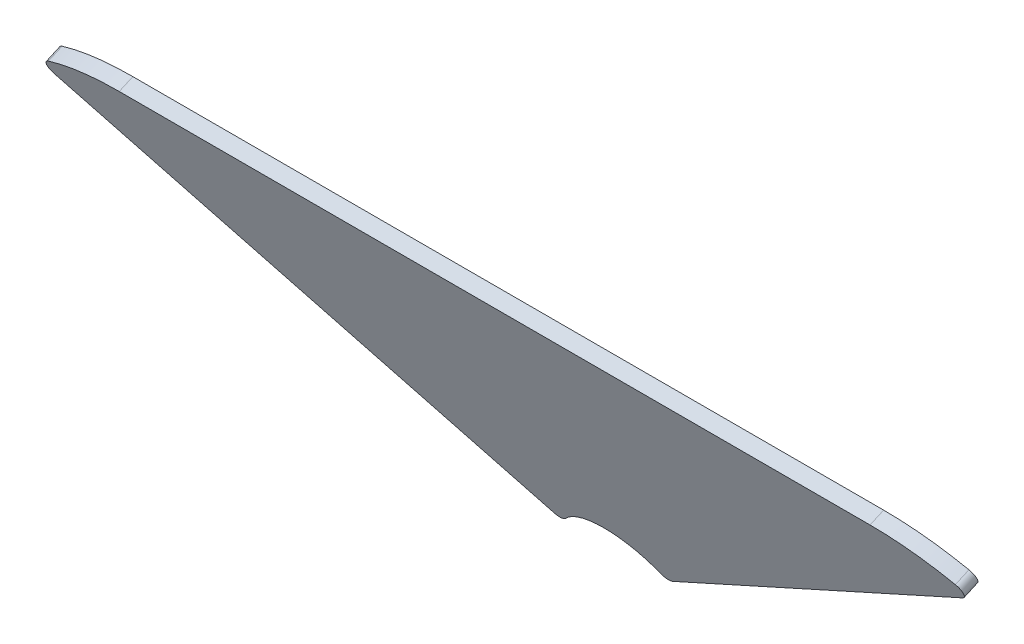
ISO-10303-21;
HEADER;
FILE_DESCRIPTION(('STEP AP214'),'2;1');
FILE_NAME('part.step','',(''),(''),'','','');
FILE_SCHEMA(('AUTOMOTIVE_DESIGN { 1 0 10303 214 1 1 1 1 }'));
ENDSEC;
DATA;
#1=APPLICATION_CONTEXT('core data for automotive mechanical design processes');
#2=APPLICATION_PROTOCOL_DEFINITION('international standard','automotive_design',2000,#1);
#3=PRODUCT_CONTEXT('',#1,'mechanical');
#4=PRODUCT('Part','Part','',(#3));
#5=PRODUCT_RELATED_PRODUCT_CATEGORY('part','',(#4));
#6=PRODUCT_DEFINITION_FORMATION('','',#4);
#7=PRODUCT_DEFINITION_CONTEXT('part definition',#1,'design');
#8=PRODUCT_DEFINITION('design','',#6,#7);
#9=PRODUCT_DEFINITION_SHAPE('','',#8);
#10=(LENGTH_UNIT() NAMED_UNIT(*) SI_UNIT(.MILLI.,.METRE.));
#11=(NAMED_UNIT(*) PLANE_ANGLE_UNIT() SI_UNIT($,.RADIAN.));
#12=(NAMED_UNIT(*) SI_UNIT($,.STERADIAN.) SOLID_ANGLE_UNIT());
#13=UNCERTAINTY_MEASURE_WITH_UNIT(LENGTH_MEASURE(1.E-05),#10,'distance_accuracy_value','');
#14=(GEOMETRIC_REPRESENTATION_CONTEXT(3) GLOBAL_UNCERTAINTY_ASSIGNED_CONTEXT((#13)) GLOBAL_UNIT_ASSIGNED_CONTEXT((#10,
#11,#12)) REPRESENTATION_CONTEXT('',''));
#15=CARTESIAN_POINT('',(0.,0.,0.));
#16=DIRECTION('',(0.,0.,1.));
#17=DIRECTION('',(1.,0.,0.));
#18=AXIS2_PLACEMENT_3D('',#15,#16,#17);
#19=CARTESIAN_POINT('',(677.077188691417,838.022688217312,1653.95807547516));
#20=DIRECTION('',(0.,-0.407574775249865,0.913171836282757));
#21=DIRECTION('',(0.,-0.913171836282757,-0.407574775249865));
#22=AXIS2_PLACEMENT_3D('',#19,#20,#21);
#23=CYLINDRICAL_SURFACE('',#22,26.5523634746972);
#24=CARTESIAN_POINT('',(677.077188691417,838.022688217312,1653.95807547516));
#25=DIRECTION('',(0.,-0.407574775249865,0.913171836282757));
#26=DIRECTION('',(0.,0.913171836282757,0.407574775249865));
#27=AXIS2_PLACEMENT_3D('',#24,#25,#26);
#28=CIRCLE('',#27,26.5523634746972);
#29=CARTESIAN_POINT('',(697.303423377007,853.731564693331,1660.96939749008));
#30=VERTEX_POINT('',#29);
#31=CARTESIAN_POINT('',(656.850964474424,853.73157593325,1660.96940250678));
#32=VERTEX_POINT('',#31);
#33=EDGE_CURVE('E159',#30,#32,#28,.T.);
#34=ORIENTED_EDGE('',*,*,#33,.F.);
#35=DIRECTION('',(0.,-0.407574775249865,0.913171836282757));
#36=VECTOR('',#35,1.);
#37=CARTESIAN_POINT('',(697.303423377007,853.731564693331,1660.96939749008));
#38=LINE('',#37,#36);
#39=CARTESIAN_POINT('',(697.303423377007,851.143464870495,1666.76803865048));
#40=VERTEX_POINT('',#39);
#41=EDGE_CURVE('E162',#30,#40,#38,.T.);
#42=ORIENTED_EDGE('',*,*,#41,.T.);
#43=CARTESIAN_POINT('',(677.077188691417,835.434588394475,1659.75671663555));
#44=DIRECTION('',(0.,-0.407574775249865,0.913171836282757));
#45=DIRECTION('',(0.,0.913171836282757,0.407574775249865));
#46=AXIS2_PLACEMENT_3D('',#43,#44,#45);
#47=CIRCLE('',#46,26.5523634746972);
#48=CARTESIAN_POINT('',(656.850964474424,851.143476110414,1666.76804366718));
#49=VERTEX_POINT('',#48);
#50=EDGE_CURVE('E145',#40,#49,#47,.T.);
#51=ORIENTED_EDGE('',*,*,#50,.T.);
#52=DIRECTION('',(0.,-0.407574775249865,0.913171836282757));
#53=VECTOR('',#52,1.);
#54=CARTESIAN_POINT('',(656.850964474424,853.73157593325,1660.96940250678));
#55=LINE('',#54,#53);
#56=EDGE_CURVE('E133',#49,#32,#55,.F.);
#57=ORIENTED_EDGE('',*,*,#56,.T.);
#58=EDGE_LOOP('',(#34,#42,#51,#57));
#59=FACE_BOUND('',#58,.T.);
#60=ADVANCED_FACE('F39',(#59),#23,.F.);
#61=CARTESIAN_POINT('',(490.472548330906,949.4143582346,1703.67537190078));
#62=DIRECTION('',(0.547162835676885,0.764348736670399,0.341150758469618));
#63=DIRECTION('',(-0.813129518351622,0.582082800282966,0.));
#64=AXIS2_PLACEMENT_3D('',#61,#62,#63);
#65=PLANE('',#64);
#66=DIRECTION('',(-0.83702618313529,0.49965369140074,0.223009769776085));
#67=VECTOR('',#66,1.);
#68=CARTESIAN_POINT('',(654.852193400312,851.289713982227,1659.87952949895));
#69=LINE('',#68,#67);
#70=CARTESIAN_POINT('',(651.8640121178,853.073476352466,1660.67567379322));
#71=VERTEX_POINT('',#70);
#72=CARTESIAN_POINT('',(483.270271113302,953.713679415674,1705.59428222464));
#73=VERTEX_POINT('',#72);
#74=EDGE_CURVE('E124',#71,#73,#69,.T.);
#75=ORIENTED_EDGE('',*,*,#74,.F.);
#76=DIRECTION('',(0.,-0.407574775249865,0.913171836282757));
#77=VECTOR('',#76,1.);
#78=CARTESIAN_POINT('',(651.8640121178,853.073476352465,1660.67567379322));
#79=LINE('',#78,#77);
#80=CARTESIAN_POINT('',(651.8640121178,850.485376529629,1666.47431495362));
#81=VERTEX_POINT('',#80);
#82=EDGE_CURVE('E187',#71,#81,#79,.T.);
#83=ORIENTED_EDGE('',*,*,#82,.T.);
#84=DIRECTION('',(-0.837026183135289,0.499653691400742,0.223009769776083));
#85=VECTOR('',#84,1.);
#86=CARTESIAN_POINT('',(490.472548330906,946.826258411763,1709.47401306118));
#87=LINE('',#86,#85);
#88=CARTESIAN_POINT('',(483.270271113302,951.125579592838,1711.39292338504));
#89=VERTEX_POINT('',#88);
#90=EDGE_CURVE('E148',#81,#89,#87,.T.);
#91=ORIENTED_EDGE('',*,*,#90,.T.);
#92=DIRECTION('',(0.,-0.407574775249865,0.913171836282757));
#93=VECTOR('',#92,1.);
#94=CARTESIAN_POINT('',(483.270271113302,953.713679415674,1705.59428222464));
#95=LINE('',#94,#93);
#96=EDGE_CURVE('E185',#89,#73,#95,.F.);
#97=ORIENTED_EDGE('',*,*,#96,.T.);
#98=EDGE_LOOP('',(#75,#83,#91,#97));
#99=FACE_BOUND('',#98,.T.);
#100=ADVANCED_FACE('F219',(#99),#65,.F.);
#101=CARTESIAN_POINT('',(516.978062295287,896.778327473055,1680.18240206171));
#102=DIRECTION('',(0.,-0.407574775249865,0.913171836282757));
#103=DIRECTION('',(0.,-0.913171836282757,-0.407574775249865));
#104=AXIS2_PLACEMENT_3D('',#101,#102,#103);
#105=CYLINDRICAL_SURFACE('',#104,76.5785320140082);
#106=CARTESIAN_POINT('',(516.978062295287,896.778327473055,1680.18240206171));
#107=DIRECTION('',(0.,0.407574775249865,-0.913171836282757));
#108=DIRECTION('',(0.,-0.913171836282757,-0.407574775249865));
#109=AXIS2_PLACEMENT_3D('',#106,#107,#108);
#110=CIRCLE('',#109,76.5785320140082);
#111=CARTESIAN_POINT('',(483.699245637993,959.759332416101,1708.29263051462));
#112=VERTEX_POINT('',#111);
#113=CARTESIAN_POINT('',(516.978062295287,966.707686172125,1711.39388003628));
#114=VERTEX_POINT('',#113);
#115=EDGE_CURVE('E114',#112,#114,#110,.T.);
#116=ORIENTED_EDGE('',*,*,#115,.F.);
#117=DIRECTION('',(0.,-0.407574775249865,0.913171836282757));
#118=VECTOR('',#117,1.);
#119=CARTESIAN_POINT('',(483.699245637993,959.759332416101,1708.29263051462));
#120=LINE('',#119,#118);
#121=CARTESIAN_POINT('',(483.699245637993,957.171232593264,1714.09127167502));
#122=VERTEX_POINT('',#121);
#123=EDGE_CURVE('E47',#112,#122,#120,.T.);
#124=ORIENTED_EDGE('',*,*,#123,.T.);
#125=CARTESIAN_POINT('',(516.978062295287,894.190227650219,1685.98104322211));
#126=DIRECTION('',(0.,0.407574775249865,-0.913171836282757));
#127=DIRECTION('',(0.,-0.913171836282757,-0.407574775249865));
#128=AXIS2_PLACEMENT_3D('',#125,#126,#127);
#129=CIRCLE('',#128,76.5785320140082);
#130=CARTESIAN_POINT('',(516.978062295287,964.119586349289,1717.19252119668));
#131=VERTEX_POINT('',#130);
#132=EDGE_CURVE('E130',#122,#131,#129,.T.);
#133=ORIENTED_EDGE('',*,*,#132,.T.);
#134=DIRECTION('',(0.,-0.407574775249865,0.913171836282757));
#135=VECTOR('',#134,1.);
#136=CARTESIAN_POINT('',(516.978062295287,966.707686172125,1711.39388003628));
#137=LINE('',#136,#135);
#138=EDGE_CURVE('E127',#114,#131,#137,.T.);
#139=ORIENTED_EDGE('',*,*,#138,.F.);
#140=EDGE_LOOP('',(#116,#124,#133,#139));
#141=FACE_BOUND('',#140,.T.);
#142=ADVANCED_FACE('F128',(#141),#105,.T.);
#143=CARTESIAN_POINT('',(516.978062295287,966.707686172125,1711.39388003628));
#144=DIRECTION('',(0.,-0.913171836282757,-0.407574775249865));
#145=DIRECTION('',(0.,0.407574775249865,-0.913171836282757));
#146=AXIS2_PLACEMENT_3D('',#143,#144,#145);
#147=PLANE('',#146);
#148=DIRECTION('',(1.,0.,0.));
#149=VECTOR('',#148,1.);
#150=CARTESIAN_POINT('',(516.978062295287,964.119586349289,1717.19252119668));
#151=LINE('',#150,#149);
#152=CARTESIAN_POINT('',(837.176459038999,964.119586349289,1717.19252119668));
#153=VERTEX_POINT('',#152);
#154=EDGE_CURVE('E152',#131,#153,#151,.T.);
#155=ORIENTED_EDGE('',*,*,#154,.T.);
#156=DIRECTION('',(0.,-0.407574775249865,0.913171836282757));
#157=VECTOR('',#156,1.);
#158=CARTESIAN_POINT('',(837.176459038999,966.707686172125,1711.39388003628));
#159=LINE('',#158,#157);
#160=CARTESIAN_POINT('',(837.176459038999,966.707686172125,1711.39388003628));
#161=VERTEX_POINT('',#160);
#162=EDGE_CURVE('E134',#161,#153,#159,.T.);
#163=ORIENTED_EDGE('',*,*,#162,.F.);
#164=DIRECTION('',(1.,0.,0.));
#165=VECTOR('',#164,1.);
#166=CARTESIAN_POINT('',(516.978062295287,966.707686172125,1711.39388003628));
#167=LINE('',#166,#165);
#168=EDGE_CURVE('E119',#114,#161,#167,.T.);
#169=ORIENTED_EDGE('',*,*,#168,.F.);
#170=ORIENTED_EDGE('',*,*,#138,.T.);
#171=EDGE_LOOP('',(#155,#163,#169,#170));
#172=FACE_BOUND('',#171,.T.);
#173=ADVANCED_FACE('F136',(#172),#147,.F.);
#174=CARTESIAN_POINT('',(837.176459038999,896.77676307733,1680.18170382704));
#175=DIRECTION('',(0.,-0.407574775249865,0.913171836282757));
#176=DIRECTION('',(0.,-0.913171836282757,-0.407574775249865));
#177=AXIS2_PLACEMENT_3D('',#174,#175,#176);
#178=CYLINDRICAL_SURFACE('',#177,76.5802451589646);
#179=CARTESIAN_POINT('',(837.176459038999,894.188663254493,1685.98034498743));
#180=DIRECTION('',(0.,0.407574775249865,-0.913171836282757));
#181=DIRECTION('',(0.,0.913171836282757,0.407574775249865));
#182=AXIS2_PLACEMENT_3D('',#179,#180,#181);
#183=CIRCLE('',#182,76.5802451589646);
#184=CARTESIAN_POINT('',(870.455414752325,957.171343910853,1714.09132135925));
#185=VERTEX_POINT('',#184);
#186=EDGE_CURVE('E154',#153,#185,#183,.T.);
#187=ORIENTED_EDGE('',*,*,#186,.T.);
#188=DIRECTION('',(0.,-0.407574775249865,0.913171836282757));
#189=VECTOR('',#188,1.);
#190=CARTESIAN_POINT('',(870.455414752325,959.759443733689,1708.29268019885));
#191=LINE('',#190,#189);
#192=CARTESIAN_POINT('',(870.455414752325,959.759443733689,1708.29268019885));
#193=VERTEX_POINT('',#192);
#194=EDGE_CURVE('E11',#185,#193,#191,.F.);
#195=ORIENTED_EDGE('',*,*,#194,.T.);
#196=CARTESIAN_POINT('',(837.176459038999,896.77676307733,1680.18170382704));
#197=DIRECTION('',(0.,0.407574775249865,-0.913171836282757));
#198=DIRECTION('',(0.,0.913171836282757,0.407574775249865));
#199=AXIS2_PLACEMENT_3D('',#196,#197,#198);
#200=CIRCLE('',#199,76.5802451589646);
#201=EDGE_CURVE('E138',#161,#193,#200,.T.);
#202=ORIENTED_EDGE('',*,*,#201,.F.);
#203=ORIENTED_EDGE('',*,*,#162,.T.);
#204=EDGE_LOOP('',(#187,#195,#202,#203));
#205=FACE_BOUND('',#204,.T.);
#206=ADVANCED_FACE('F195',(#205),#178,.T.);
#207=CARTESIAN_POINT('',(699.302193400309,851.289700826273,1659.87952362707));
#208=DIRECTION('',(-0.547162573327616,0.764348893276893,0.341150828367586));
#209=DIRECTION('',(-0.813129706896313,-0.582082536898948,0.));
#210=AXIS2_PLACEMENT_3D('',#207,#208,#209);
#211=PLANE('',#210);
#212=DIRECTION('',(-0.837026354632577,-0.499653451830778,-0.223009662849142));
#213=VECTOR('',#212,1.);
#214=CARTESIAN_POINT('',(699.302193400309,848.701601003437,1665.67816478746));
#215=LINE('',#214,#213);
#216=CARTESIAN_POINT('',(870.884418398522,951.125677041992,1711.39296687939));
#217=VERTEX_POINT('',#216);
#218=CARTESIAN_POINT('',(702.29037623622,850.485363080223,1666.47430895076));
#219=VERTEX_POINT('',#218);
#220=EDGE_CURVE('E156',#217,#219,#215,.T.);
#221=ORIENTED_EDGE('',*,*,#220,.T.);
#222=DIRECTION('',(0.,-0.407574775249865,0.913171836282757));
#223=VECTOR('',#222,1.);
#224=CARTESIAN_POINT('',(702.29037623622,853.073462903059,1660.67566779037));
#225=LINE('',#224,#223);
#226=CARTESIAN_POINT('',(702.29037623622,853.073462903059,1660.67566779037));
#227=VERTEX_POINT('',#226);
#228=EDGE_CURVE('E176',#219,#227,#225,.F.);
#229=ORIENTED_EDGE('',*,*,#228,.T.);
#230=DIRECTION('',(-0.837026354632577,-0.499653451830779,-0.223009662849141));
#231=VECTOR('',#230,1.);
#232=CARTESIAN_POINT('',(863.682097563977,949.4144325894,1703.67540508746));
#233=LINE('',#232,#231);
#234=CARTESIAN_POINT('',(870.884418398522,953.713776864829,1705.594325719));
#235=VERTEX_POINT('',#234);
#236=EDGE_CURVE('E140',#235,#227,#233,.T.);
#237=ORIENTED_EDGE('',*,*,#236,.F.);
#238=DIRECTION('',(0.,-0.407574775249865,0.913171836282757));
#239=VECTOR('',#238,1.);
#240=CARTESIAN_POINT('',(870.884418398522,953.713776864829,1705.594325719));
#241=LINE('',#240,#239);
#242=EDGE_CURVE('E173',#235,#217,#241,.T.);
#243=ORIENTED_EDGE('',*,*,#242,.T.);
#244=EDGE_LOOP('',(#221,#229,#237,#243));
#245=FACE_BOUND('',#244,.T.);
#246=ADVANCED_FACE('F202',(#245),#211,.F.);
#247=CARTESIAN_POINT('',(677.077188691417,838.022688217312,1653.95807547516));
#248=DIRECTION('',(0.,0.407574775249865,-0.913171836282757));
#249=DIRECTION('',(0.,0.913171836282757,0.407574775249865));
#250=AXIS2_PLACEMENT_3D('',#247,#248,#249);
#251=PLANE('',#250);
#252=ORIENTED_EDGE('',*,*,#236,.T.);
#253=CARTESIAN_POINT('',(700.205686831841,855.985632186444,1661.97545244645));
#254=DIRECTION('',(0.,0.407574775249865,-0.913171836282757));
#255=DIRECTION('',(0.,0.913171836282757,0.407574775249865));
#256=AXIS2_PLACEMENT_3D('',#253,#254,#255);
#257=CIRCLE('',#256,3.81);
#258=EDGE_CURVE('E183',#227,#30,#257,.T.);
#259=ORIENTED_EDGE('',*,*,#258,.T.);
#260=ORIENTED_EDGE('',*,*,#33,.T.);
#261=CARTESIAN_POINT('',(653.948702521729,855.98564503918,1661.97545818299));
#262=DIRECTION('',(0.,0.407574775249865,-0.913171836282757));
#263=DIRECTION('',(0.,0.913171836282757,0.407574775249865));
#264=AXIS2_PLACEMENT_3D('',#261,#262,#263);
#265=CIRCLE('',#264,3.81);
#266=EDGE_CURVE('E181',#32,#71,#265,.T.);
#267=ORIENTED_EDGE('',*,*,#266,.T.);
#268=ORIENTED_EDGE('',*,*,#74,.T.);
#269=CARTESIAN_POINT('',(485.354961517231,956.625848102389,1706.89406661441));
#270=DIRECTION('',(0.,0.407574775249865,-0.913171836282757));
#271=DIRECTION('',(0.,0.913171836282757,0.407574775249865));
#272=AXIS2_PLACEMENT_3D('',#269,#270,#271);
#273=CIRCLE('',#272,3.81);
#274=EDGE_CURVE('E60',#73,#112,#273,.T.);
#275=ORIENTED_EDGE('',*,*,#274,.T.);
#276=ORIENTED_EDGE('',*,*,#115,.T.);
#277=ORIENTED_EDGE('',*,*,#168,.T.);
#278=ORIENTED_EDGE('',*,*,#201,.T.);
#279=CARTESIAN_POINT('',(868.799728994144,956.625946148214,1706.89411037508));
#280=DIRECTION('',(0.,0.407574775249865,-0.913171836282757));
#281=DIRECTION('',(0.,0.913171836282757,0.407574775249865));
#282=AXIS2_PLACEMENT_3D('',#279,#280,#281);
#283=CIRCLE('',#282,3.81);
#284=EDGE_CURVE('E178',#193,#235,#283,.T.);
#285=ORIENTED_EDGE('',*,*,#284,.T.);
#286=EDGE_LOOP('',(#252,#259,#260,#267,#268,#275,#276,#277,#278,#285));
#287=FACE_BOUND('',#286,.T.);
#288=ADVANCED_FACE('F117',(#287),#251,.T.);
#289=CARTESIAN_POINT('',(677.077188691417,835.434588394475,1659.75671663555));
#290=DIRECTION('',(0.,0.407574775249865,-0.913171836282757));
#291=DIRECTION('',(0.,0.913171836282757,0.407574775249865));
#292=AXIS2_PLACEMENT_3D('',#289,#290,#291);
#293=PLANE('',#292);
#294=ORIENTED_EDGE('',*,*,#50,.F.);
#295=CARTESIAN_POINT('',(700.205686831841,853.397532363608,1667.77409360684));
#296=DIRECTION('',(0.,0.407574775249865,-0.913171836282757));
#297=DIRECTION('',(0.,0.913171836282757,0.407574775249865));
#298=AXIS2_PLACEMENT_3D('',#295,#296,#297);
#299=CIRCLE('',#298,3.81);
#300=EDGE_CURVE('E171',#40,#219,#299,.F.);
#301=ORIENTED_EDGE('',*,*,#300,.T.);
#302=ORIENTED_EDGE('',*,*,#220,.F.);
#303=CARTESIAN_POINT('',(868.799728994144,954.037846325377,1712.69275153547));
#304=DIRECTION('',(0.,0.407574775249865,-0.913171836282757));
#305=DIRECTION('',(0.,0.913171836282757,0.407574775249865));
#306=AXIS2_PLACEMENT_3D('',#303,#304,#305);
#307=CIRCLE('',#306,3.81);
#308=EDGE_CURVE('E165',#217,#185,#307,.F.);
#309=ORIENTED_EDGE('',*,*,#308,.T.);
#310=ORIENTED_EDGE('',*,*,#186,.F.);
#311=ORIENTED_EDGE('',*,*,#154,.F.);
#312=ORIENTED_EDGE('',*,*,#132,.F.);
#313=CARTESIAN_POINT('',(485.354961517231,954.037748279552,1712.69270777481));
#314=DIRECTION('',(0.,0.407574775249865,-0.913171836282757));
#315=DIRECTION('',(0.,0.913171836282757,0.407574775249865));
#316=AXIS2_PLACEMENT_3D('',#313,#314,#315);
#317=CIRCLE('',#316,3.81);
#318=EDGE_CURVE('E167',#122,#89,#317,.F.);
#319=ORIENTED_EDGE('',*,*,#318,.T.);
#320=ORIENTED_EDGE('',*,*,#90,.F.);
#321=CARTESIAN_POINT('',(653.948702521729,853.397545216343,1667.77409934339));
#322=DIRECTION('',(0.,0.407574775249865,-0.913171836282757));
#323=DIRECTION('',(0.,0.913171836282757,0.407574775249865));
#324=AXIS2_PLACEMENT_3D('',#321,#322,#323);
#325=CIRCLE('',#324,3.81);
#326=EDGE_CURVE('E169',#81,#49,#325,.F.);
#327=ORIENTED_EDGE('',*,*,#326,.T.);
#328=EDGE_LOOP('',(#294,#301,#302,#309,#310,#311,#312,#319,#320,#327));
#329=FACE_BOUND('',#328,.T.);
#330=ADVANCED_FACE('F192',(#329),#293,.F.);
#331=CARTESIAN_POINT('',(700.205686831841,855.985632186444,1661.97545244645));
#332=DIRECTION('',(0.,-0.407574775249865,0.913171836282757));
#333=DIRECTION('',(0.,-0.913171836282757,-0.407574775249865));
#334=AXIS2_PLACEMENT_3D('',#331,#332,#333);
#335=CYLINDRICAL_SURFACE('',#334,3.81);
#336=ORIENTED_EDGE('',*,*,#258,.F.);
#337=ORIENTED_EDGE('',*,*,#228,.F.);
#338=ORIENTED_EDGE('',*,*,#300,.F.);
#339=ORIENTED_EDGE('',*,*,#41,.F.);
#340=EDGE_LOOP('',(#336,#337,#338,#339));
#341=FACE_BOUND('',#340,.T.);
#342=ADVANCED_FACE('F207',(#341),#335,.T.);
#343=CARTESIAN_POINT('',(653.948702521729,855.98564503918,1661.97545818299));
#344=DIRECTION('',(0.,-0.407574775249865,0.913171836282757));
#345=DIRECTION('',(0.,-0.913171836282757,-0.407574775249865));
#346=AXIS2_PLACEMENT_3D('',#343,#344,#345);
#347=CYLINDRICAL_SURFACE('',#346,3.81);
#348=ORIENTED_EDGE('',*,*,#266,.F.);
#349=ORIENTED_EDGE('',*,*,#56,.F.);
#350=ORIENTED_EDGE('',*,*,#326,.F.);
#351=ORIENTED_EDGE('',*,*,#82,.F.);
#352=EDGE_LOOP('',(#348,#349,#350,#351));
#353=FACE_BOUND('',#352,.T.);
#354=ADVANCED_FACE('F221',(#353),#347,.T.);
#355=CARTESIAN_POINT('',(485.354961517231,956.625848102388,1706.89406661441));
#356=DIRECTION('',(0.,-0.407574775249865,0.913171836282757));
#357=DIRECTION('',(0.,-0.913171836282757,-0.407574775249865));
#358=AXIS2_PLACEMENT_3D('',#355,#356,#357);
#359=CYLINDRICAL_SURFACE('',#358,3.81);
#360=ORIENTED_EDGE('',*,*,#274,.F.);
#361=ORIENTED_EDGE('',*,*,#96,.F.);
#362=ORIENTED_EDGE('',*,*,#318,.F.);
#363=ORIENTED_EDGE('',*,*,#123,.F.);
#364=EDGE_LOOP('',(#360,#361,#362,#363));
#365=FACE_BOUND('',#364,.T.);
#366=ADVANCED_FACE('F218',(#365),#359,.T.);
#367=CARTESIAN_POINT('',(868.799728994144,956.625946148214,1706.89411037508));
#368=DIRECTION('',(0.,-0.407574775249865,0.913171836282757));
#369=DIRECTION('',(0.,-0.913171836282757,-0.407574775249865));
#370=AXIS2_PLACEMENT_3D('',#367,#368,#369);
#371=CYLINDRICAL_SURFACE('',#370,3.81);
#372=ORIENTED_EDGE('',*,*,#284,.F.);
#373=ORIENTED_EDGE('',*,*,#194,.F.);
#374=ORIENTED_EDGE('',*,*,#308,.F.);
#375=ORIENTED_EDGE('',*,*,#242,.F.);
#376=EDGE_LOOP('',(#372,#373,#374,#375));
#377=FACE_BOUND('',#376,.T.);
#378=ADVANCED_FACE('F41',(#377),#371,.T.);
#379=CLOSED_SHELL('',(#60,#100,#142,#173,#206,#246,#288,#330,#342,#354,#366,#378));
#380=MANIFOLD_SOLID_BREP('B2',#379);
#381=ADVANCED_BREP_SHAPE_REPRESENTATION('',(#18,#380),#14);
#382=SHAPE_DEFINITION_REPRESENTATION(#9,#381);
ENDSEC;
END-ISO-10303-21;
